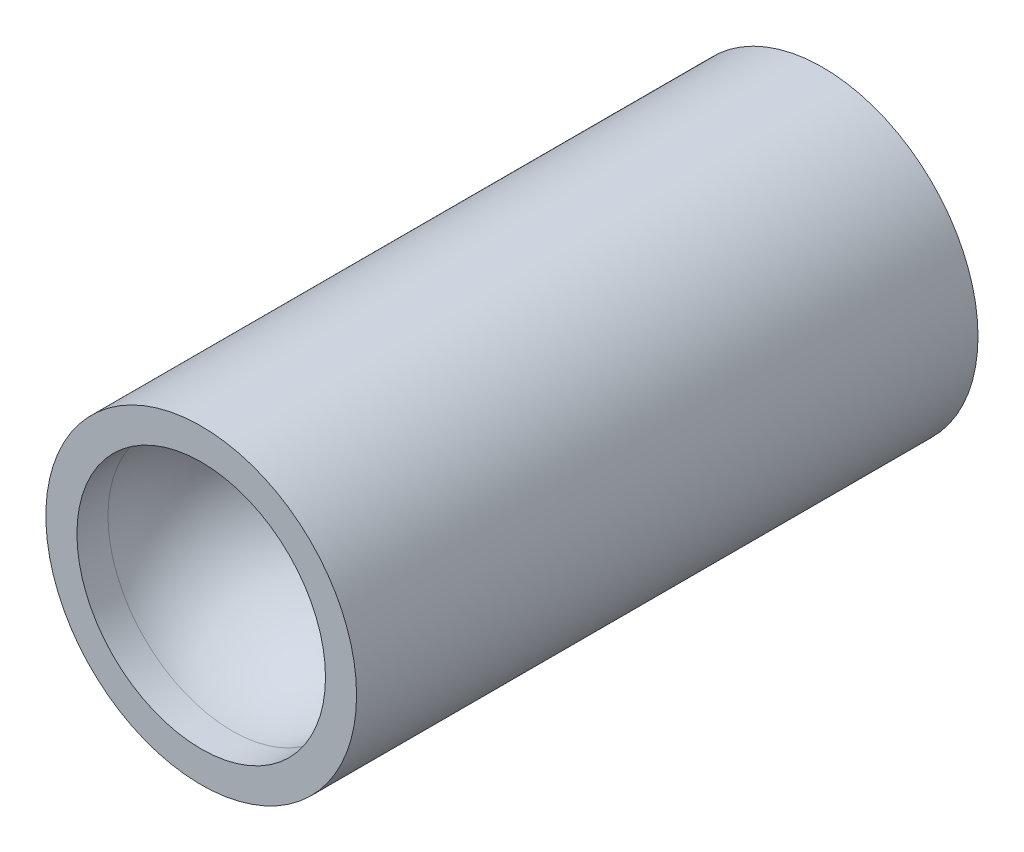
ISO-10303-21;
HEADER;
FILE_DESCRIPTION(('STEP AP214'),'2;1');
FILE_NAME('part.step','',(''),(''),'','','');
FILE_SCHEMA(('AUTOMOTIVE_DESIGN { 1 0 10303 214 1 1 1 1 }'));
ENDSEC;
DATA;
#1=APPLICATION_CONTEXT('core data for automotive mechanical design processes');
#2=APPLICATION_PROTOCOL_DEFINITION('international standard','automotive_design',2000,#1);
#3=PRODUCT_CONTEXT('',#1,'mechanical');
#4=PRODUCT('Part','Part','',(#3));
#5=PRODUCT_RELATED_PRODUCT_CATEGORY('part','',(#4));
#6=PRODUCT_DEFINITION_FORMATION('','',#4);
#7=PRODUCT_DEFINITION_CONTEXT('part definition',#1,'design');
#8=PRODUCT_DEFINITION('design','',#6,#7);
#9=PRODUCT_DEFINITION_SHAPE('','',#8);
#10=(LENGTH_UNIT() NAMED_UNIT(*) SI_UNIT(.MILLI.,.METRE.));
#11=(NAMED_UNIT(*) PLANE_ANGLE_UNIT() SI_UNIT($,.RADIAN.));
#12=(NAMED_UNIT(*) SI_UNIT($,.STERADIAN.) SOLID_ANGLE_UNIT());
#13=UNCERTAINTY_MEASURE_WITH_UNIT(LENGTH_MEASURE(1.E-05),#10,'distance_accuracy_value','');
#14=(GEOMETRIC_REPRESENTATION_CONTEXT(3) GLOBAL_UNCERTAINTY_ASSIGNED_CONTEXT((#13)) GLOBAL_UNIT_ASSIGNED_CONTEXT((#10,
#11,#12)) REPRESENTATION_CONTEXT('',''));
#15=CARTESIAN_POINT('',(0.,0.,0.));
#16=DIRECTION('',(0.,0.,1.));
#17=DIRECTION('',(1.,0.,0.));
#18=AXIS2_PLACEMENT_3D('',#15,#16,#17);
#19=CARTESIAN_POINT('',(0.,0.,20.));
#20=DIRECTION('',(0.,0.,-1.));
#21=DIRECTION('',(-1.,0.,0.));
#22=AXIS2_PLACEMENT_3D('',#19,#20,#21);
#23=CYLINDRICAL_SURFACE('',#22,5.);
#24=CARTESIAN_POINT('',(0.,0.,20.));
#25=DIRECTION('',(0.,0.,1.));
#26=DIRECTION('',(1.,0.,0.));
#27=AXIS2_PLACEMENT_3D('',#24,#25,#26);
#28=CIRCLE('',#27,5.);
#29=CARTESIAN_POINT('',(5.,0.,20.));
#30=VERTEX_POINT('',#29);
#31=EDGE_CURVE('E10',#30,#30,#28,.T.);
#32=ORIENTED_EDGE('',*,*,#31,.F.);
#33=EDGE_LOOP('',(#32));
#34=FACE_BOUND('',#33,.T.);
#35=CARTESIAN_POINT('',(0.,0.,0.));
#36=DIRECTION('',(0.,0.,1.));
#37=DIRECTION('',(1.,0.,0.));
#38=AXIS2_PLACEMENT_3D('',#35,#36,#37);
#39=CIRCLE('',#38,5.);
#40=CARTESIAN_POINT('',(5.,0.,0.));
#41=VERTEX_POINT('',#40);
#42=EDGE_CURVE('E43',#41,#41,#39,.T.);
#43=ORIENTED_EDGE('',*,*,#42,.T.);
#44=EDGE_LOOP('',(#43));
#45=FACE_BOUND('',#44,.T.);
#46=ADVANCED_FACE('F40',(#34,#45),#23,.T.);
#47=CARTESIAN_POINT('',(0.,0.,20.));
#48=DIRECTION('',(0.,0.,1.));
#49=DIRECTION('',(1.,0.,0.));
#50=AXIS2_PLACEMENT_3D('',#47,#48,#49);
#51=PLANE('',#50);
#52=CARTESIAN_POINT('',(0.,0.,20.));
#53=DIRECTION('',(0.,0.,1.));
#54=DIRECTION('',(1.,0.,0.));
#55=AXIS2_PLACEMENT_3D('',#52,#53,#54);
#56=CIRCLE('',#55,4.);
#57=CARTESIAN_POINT('',(4.,0.,20.));
#58=VERTEX_POINT('',#57);
#59=EDGE_CURVE('E50',#58,#58,#56,.T.);
#60=ORIENTED_EDGE('',*,*,#59,.F.);
#61=EDGE_LOOP('',(#60));
#62=FACE_BOUND('',#61,.T.);
#63=ORIENTED_EDGE('',*,*,#31,.T.);
#64=EDGE_LOOP('',(#63));
#65=FACE_BOUND('',#64,.T.);
#66=ADVANCED_FACE('F70',(#62,#65),#51,.T.);
#67=CARTESIAN_POINT('',(0.,0.,0.));
#68=DIRECTION('',(0.,0.,1.));
#69=DIRECTION('',(1.,0.,0.));
#70=AXIS2_PLACEMENT_3D('',#67,#68,#69);
#71=PLANE('',#70);
#72=ORIENTED_EDGE('',*,*,#42,.F.);
#73=EDGE_LOOP('',(#72));
#74=FACE_BOUND('',#73,.T.);
#75=ADVANCED_FACE('F67',(#74),#71,.F.);
#76=CARTESIAN_POINT('',(0.,0.,19.));
#77=DIRECTION('',(0.,0.,1.));
#78=DIRECTION('',(1.,0.,0.));
#79=AXIS2_PLACEMENT_3D('',#76,#77,#78);
#80=CYLINDRICAL_SURFACE('',#79,4.);
#81=CARTESIAN_POINT('',(0.,0.,19.));
#82=DIRECTION('',(0.,0.,1.));
#83=DIRECTION('',(1.,0.,0.));
#84=AXIS2_PLACEMENT_3D('',#81,#82,#83);
#85=CIRCLE('',#84,4.);
#86=CARTESIAN_POINT('',(4.,0.,19.));
#87=VERTEX_POINT('',#86);
#88=EDGE_CURVE('E54',#87,#87,#85,.F.);
#89=ORIENTED_EDGE('',*,*,#88,.T.);
#90=EDGE_LOOP('',(#89));
#91=FACE_BOUND('',#90,.T.);
#92=ORIENTED_EDGE('',*,*,#59,.T.);
#93=EDGE_LOOP('',(#92));
#94=FACE_BOUND('',#93,.T.);
#95=ADVANCED_FACE('F58',(#91,#94),#80,.F.);
#96=CARTESIAN_POINT('',(0.,0.,19.));
#97=DIRECTION('',(0.,-1.,0.));
#98=DIRECTION('',(-1.,0.,0.));
#99=AXIS2_PLACEMENT_3D('',#96,#97,#98);
#100=SPHERICAL_SURFACE('',#99,4.);
#101=CARTESIAN_POINT('',(0.,0.,19.));
#102=DIRECTION('',(0.,0.,1.));
#103=DIRECTION('',(1.,0.,0.));
#104=AXIS2_PLACEMENT_3D('',#101,#102,#103);
#105=SPHERICAL_SURFACE('',#104,4.);
#106=ORIENTED_EDGE('',*,*,#88,.F.);
#107=EDGE_LOOP('',(#106));
#108=FACE_BOUND('',#107,.T.);
#109=ADVANCED_FACE('F61',(#108),#105,.F.);
#110=CLOSED_SHELL('',(#46,#66,#75,#95,#109));
#111=MANIFOLD_SOLID_BREP('B2',#110);
#112=ADVANCED_BREP_SHAPE_REPRESENTATION('',(#18,#111),#14);
#113=SHAPE_DEFINITION_REPRESENTATION(#9,#112);
ENDSEC;
END-ISO-10303-21;
